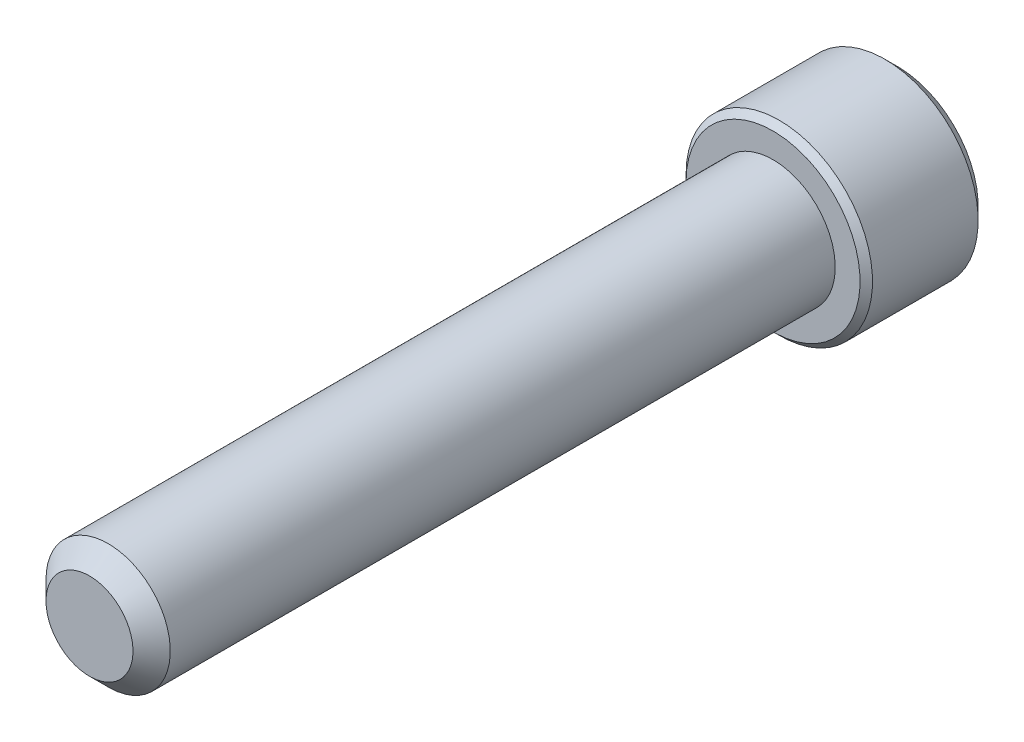
ISO-10303-21;
HEADER;
FILE_DESCRIPTION(('STEP AP214'),'2;1');
FILE_NAME('part.step','',(''),(''),'','','');
FILE_SCHEMA(('AUTOMOTIVE_DESIGN { 1 0 10303 214 1 1 1 1 }'));
ENDSEC;
DATA;
#1=APPLICATION_CONTEXT('core data for automotive mechanical design processes');
#2=APPLICATION_PROTOCOL_DEFINITION('international standard','automotive_design',2000,#1);
#3=PRODUCT_CONTEXT('',#1,'mechanical');
#4=PRODUCT('Part','Part','',(#3));
#5=PRODUCT_RELATED_PRODUCT_CATEGORY('part','',(#4));
#6=PRODUCT_DEFINITION_FORMATION('','',#4);
#7=PRODUCT_DEFINITION_CONTEXT('part definition',#1,'design');
#8=PRODUCT_DEFINITION('design','',#6,#7);
#9=PRODUCT_DEFINITION_SHAPE('','',#8);
#10=(LENGTH_UNIT() NAMED_UNIT(*) SI_UNIT(.MILLI.,.METRE.));
#11=(NAMED_UNIT(*) PLANE_ANGLE_UNIT() SI_UNIT($,.RADIAN.));
#12=(NAMED_UNIT(*) SI_UNIT($,.STERADIAN.) SOLID_ANGLE_UNIT());
#13=UNCERTAINTY_MEASURE_WITH_UNIT(LENGTH_MEASURE(1.E-05),#10,'distance_accuracy_value','');
#14=(GEOMETRIC_REPRESENTATION_CONTEXT(3) GLOBAL_UNCERTAINTY_ASSIGNED_CONTEXT((#13)) GLOBAL_UNIT_ASSIGNED_CONTEXT((#10,
#11,#12)) REPRESENTATION_CONTEXT('',''));
#15=CARTESIAN_POINT('',(0.,0.,0.));
#16=DIRECTION('',(0.,0.,1.));
#17=DIRECTION('',(1.,0.,0.));
#18=AXIS2_PLACEMENT_3D('',#15,#16,#17);
#19=CARTESIAN_POINT('',(0.,0.,-34.925));
#20=DIRECTION('',(0.,0.,1.));
#21=DIRECTION('',(1.,0.,0.));
#22=AXIS2_PLACEMENT_3D('',#19,#20,#21);
#23=CYLINDRICAL_SURFACE('',#22,3.175);
#24=CARTESIAN_POINT('',(0.,0.,-0.952500000000002));
#25=DIRECTION('',(0.,0.,1.));
#26=DIRECTION('',(1.,0.,0.));
#27=AXIS2_PLACEMENT_3D('',#24,#25,#26);
#28=CIRCLE('',#27,3.175);
#29=CARTESIAN_POINT('',(-3.175,0.,-0.952500000000002));
#30=VERTEX_POINT('',#29);
#31=EDGE_CURVE('E108',#30,#30,#28,.F.);
#32=ORIENTED_EDGE('',*,*,#31,.T.);
#33=EDGE_LOOP('',(#32));
#34=FACE_BOUND('',#33,.T.);
#35=CARTESIAN_POINT('',(0.,0.,-34.925));
#36=DIRECTION('',(0.,0.,-1.));
#37=DIRECTION('',(-1.,0.,0.));
#38=AXIS2_PLACEMENT_3D('',#35,#36,#37);
#39=CIRCLE('',#38,3.175);
#40=CARTESIAN_POINT('',(-3.175,0.,-34.925));
#41=VERTEX_POINT('',#40);
#42=EDGE_CURVE('E208',#41,#41,#39,.F.);
#43=ORIENTED_EDGE('',*,*,#42,.T.);
#44=EDGE_LOOP('',(#43));
#45=FACE_BOUND('',#44,.T.);
#46=ADVANCED_FACE('F34',(#34,#45),#23,.T.);
#47=CARTESIAN_POINT('',(0.,0.,0.));
#48=DIRECTION('',(0.,0.,1.));
#49=DIRECTION('',(1.,0.,0.));
#50=AXIS2_PLACEMENT_3D('',#47,#48,#49);
#51=PLANE('',#50);
#52=CARTESIAN_POINT('',(0.,0.,0.));
#53=DIRECTION('',(0.,0.,1.));
#54=DIRECTION('',(1.,0.,0.));
#55=AXIS2_PLACEMENT_3D('',#52,#53,#54);
#56=CIRCLE('',#55,2.2225);
#57=CARTESIAN_POINT('',(-2.2225,0.,0.));
#58=VERTEX_POINT('',#57);
#59=EDGE_CURVE('E207',#58,#58,#56,.T.);
#60=ORIENTED_EDGE('',*,*,#59,.T.);
#61=EDGE_LOOP('',(#60));
#62=FACE_BOUND('',#61,.T.);
#63=ADVANCED_FACE('F185',(#62),#51,.T.);
#64=CARTESIAN_POINT('',(0.,0.,0.));
#65=DIRECTION('',(0.,0.,-1.));
#66=DIRECTION('',(-1.,0.,0.));
#67=AXIS2_PLACEMENT_3D('',#64,#65,#66);
#68=CONICAL_SURFACE('',#67,2.2225,0.785398163397446);
#69=CARTESIAN_POINT('',(-3.175,0.,-0.952500000000002));
#70=CARTESIAN_POINT('',(-3.165078125,0.,-0.942578125000002));
#71=CARTESIAN_POINT('',(-3.15515625,0.,-0.932656250000002));
#72=CARTESIAN_POINT('',(-3.1353125,0.,-0.912812500000002));
#73=CARTESIAN_POINT('',(-3.125390625,0.,-0.902890625000002));
#74=CARTESIAN_POINT('',(-3.105546875,0.,-0.883046875000002));
#75=CARTESIAN_POINT('',(-3.095625,0.,-0.873125000000002));
#76=CARTESIAN_POINT('',(-3.07578125,0.,-0.853281250000002));
#77=CARTESIAN_POINT('',(-3.065859375,0.,-0.843359375000002));
#78=CARTESIAN_POINT('',(-3.046015625,0.,-0.823515625000002));
#79=CARTESIAN_POINT('',(-3.03609375,0.,-0.813593750000002));
#80=CARTESIAN_POINT('',(-3.01625,0.,-0.793750000000002));
#81=CARTESIAN_POINT('',(-3.006328125,0.,-0.783828125000002));
#82=CARTESIAN_POINT('',(-2.986484375,0.,-0.763984375000002));
#83=CARTESIAN_POINT('',(-2.9765625,0.,-0.754062500000002));
#84=CARTESIAN_POINT('',(-2.95671875,0.,-0.734218750000002));
#85=CARTESIAN_POINT('',(-2.946796875,0.,-0.724296875000002));
#86=CARTESIAN_POINT('',(-2.926953125,0.,-0.704453125000002));
#87=CARTESIAN_POINT('',(-2.91703125,0.,-0.694531250000002));
#88=CARTESIAN_POINT('',(-2.8971875,0.,-0.674687500000001));
#89=CARTESIAN_POINT('',(-2.887265625,0.,-0.664765625000001));
#90=CARTESIAN_POINT('',(-2.867421875,0.,-0.644921875000001));
#91=CARTESIAN_POINT('',(-2.8575,0.,-0.635000000000001));
#92=CARTESIAN_POINT('',(-2.83765625,0.,-0.615156250000001));
#93=CARTESIAN_POINT('',(-2.827734375,0.,-0.605234375000001));
#94=CARTESIAN_POINT('',(-2.807890625,0.,-0.585390625000001));
#95=CARTESIAN_POINT('',(-2.79796875,0.,-0.575468750000001));
#96=CARTESIAN_POINT('',(-2.778125,0.,-0.555625000000001));
#97=CARTESIAN_POINT('',(-2.768203125,0.,-0.545703125000001));
#98=CARTESIAN_POINT('',(-2.748359375,0.,-0.525859375000001));
#99=CARTESIAN_POINT('',(-2.7384375,0.,-0.515937500000001));
#100=CARTESIAN_POINT('',(-2.71859375,0.,-0.496093750000001));
#101=CARTESIAN_POINT('',(-2.708671875,0.,-0.486171875000001));
#102=CARTESIAN_POINT('',(-2.688828125,0.,-0.466328125000001));
#103=CARTESIAN_POINT('',(-2.67890625,0.,-0.456406250000001));
#104=CARTESIAN_POINT('',(-2.6590625,0.,-0.436562500000001));
#105=CARTESIAN_POINT('',(-2.649140625,0.,-0.426640625000001));
#106=CARTESIAN_POINT('',(-2.629296875,0.,-0.406796875000001));
#107=CARTESIAN_POINT('',(-2.619375,0.,-0.396875000000001));
#108=CARTESIAN_POINT('',(-2.59953125,0.,-0.377031250000001));
#109=CARTESIAN_POINT('',(-2.589609375,0.,-0.367109375000001));
#110=CARTESIAN_POINT('',(-2.569765625,0.,-0.347265625000001));
#111=CARTESIAN_POINT('',(-2.55984375,0.,-0.337343750000001));
#112=CARTESIAN_POINT('',(-2.54,0.,-0.317500000000001));
#113=CARTESIAN_POINT('',(-2.530078125,0.,-0.307578125000001));
#114=CARTESIAN_POINT('',(-2.510234375,0.,-0.287734375000001));
#115=CARTESIAN_POINT('',(-2.5003125,0.,-0.277812500000001));
#116=CARTESIAN_POINT('',(-2.48046875,0.,-0.257968750000001));
#117=CARTESIAN_POINT('',(-2.470546875,0.,-0.248046875));
#118=CARTESIAN_POINT('',(-2.450703125,0.,-0.228203125));
#119=CARTESIAN_POINT('',(-2.44078125,0.,-0.21828125));
#120=CARTESIAN_POINT('',(-2.4209375,0.,-0.1984375));
#121=CARTESIAN_POINT('',(-2.411015625,0.,-0.188515625));
#122=CARTESIAN_POINT('',(-2.391171875,0.,-0.168671875));
#123=CARTESIAN_POINT('',(-2.38125,0.,-0.15875));
#124=CARTESIAN_POINT('',(-2.36140625,0.,-0.13890625));
#125=CARTESIAN_POINT('',(-2.351484375,0.,-0.128984375));
#126=CARTESIAN_POINT('',(-2.331640625,0.,-0.109140625));
#127=CARTESIAN_POINT('',(-2.32171875,0.,-0.0992187500000001));
#128=CARTESIAN_POINT('',(-2.301875,0.,-0.0793750000000001));
#129=CARTESIAN_POINT('',(-2.291953125,0.,-0.0694531250000002));
#130=CARTESIAN_POINT('',(-2.272109375,0.,-0.0496093750000001));
#131=CARTESIAN_POINT('',(-2.2621875,0.,-0.0396875000000001));
#132=CARTESIAN_POINT('',(-2.24234375,0.,-0.01984375));
#133=CARTESIAN_POINT('',(-2.232421875,0.,-0.00992187499999998));
#134=CARTESIAN_POINT('',(-2.2225,0.,0.));
#135=B_SPLINE_CURVE_WITH_KNOTS('',3,(#69,#70,#71,#72,#73,#74,#75,#76,#77,#78,#79,#80,#81,#82,
#83,#84,#85,#86,#87,#88,#89,#90,#91,#92,#93,#94,#95,#96,#97,#98,#99,#100,#101,#102,#103,#104,
#105,#106,#107,#108,#109,#110,#111,#112,#113,#114,#115,#116,#117,#118,#119,#120,#121,#122,#123,
#124,#125,#126,#127,#128,#129,#130,#131,#132,#133,#134),.UNSPECIFIED.,.F.,.F.,(4,2,2,2,2,2,2,2,
2,2,2,2,2,2,2,2,2,2,2,2,2,2,2,2,2,2,2,2,2,2,2,2,4),(0.,0.0420949505675116,0.0841899011350232,
0.126284851702535,0.168379802270046,0.210474752837558,0.25256970340507,0.294664653972581,
0.336759604540093,0.378854555107605,0.420949505675116,0.463044456242628,0.50513940681014,
0.547234357377651,0.589329307945163,0.631424258512675,0.673519209080186,0.715614159647698,
0.75770911021521,0.799804060782721,0.841899011350233,0.883993961917745,0.926088912485256,
0.968183863052768,1.01027881362028,1.05237376418779,1.0944687147553,1.13656366532281,
1.17865861589033,1.22075356645784,1.26284851702535,1.30494346759286,1.34703841816037),.UNSPECIFIED.);
#136=EDGE_CURVE('BSEAM191',#30,#58,#135,.T.);
#137=ORIENTED_EDGE('',*,*,#31,.F.);
#138=ORIENTED_EDGE('',*,*,#59,.F.);
#139=ORIENTED_EDGE('',*,*,#136,.T.);
#140=ORIENTED_EDGE('',*,*,#136,.F.);
#141=EDGE_LOOP('',(#137,#139,#138,#140));
#142=FACE_BOUND('',#141,.T.);
#143=ADVANCED_FACE('F191',(#142),#68,.T.);
#144=CARTESIAN_POINT('',(0.,0.,-41.275));
#145=DIRECTION('',(0.,0.,1.));
#146=DIRECTION('',(1.,0.,0.));
#147=AXIS2_PLACEMENT_3D('',#144,#145,#146);
#148=CYLINDRICAL_SURFACE('',#147,4.7625);
#149=CARTESIAN_POINT('',(0.,0.,-35.2425));
#150=DIRECTION('',(0.,0.,-1.));
#151=DIRECTION('',(-1.,0.,0.));
#152=AXIS2_PLACEMENT_3D('',#149,#150,#151);
#153=CIRCLE('',#152,4.7625);
#154=CARTESIAN_POINT('',(-4.7625,0.,-35.2425));
#155=VERTEX_POINT('',#154);
#156=EDGE_CURVE('E42',#155,#155,#153,.T.);
#157=ORIENTED_EDGE('',*,*,#156,.T.);
#158=EDGE_LOOP('',(#157));
#159=FACE_BOUND('',#158,.T.);
#160=CARTESIAN_POINT('',(0.,0.,-40.64));
#161=DIRECTION('',(0.,0.,-1.));
#162=DIRECTION('',(-1.,0.,0.));
#163=AXIS2_PLACEMENT_3D('',#160,#161,#162);
#164=CIRCLE('',#163,4.7625);
#165=CARTESIAN_POINT('',(-4.7625,0.,-40.64));
#166=VERTEX_POINT('',#165);
#167=EDGE_CURVE('E168',#166,#166,#164,.F.);
#168=ORIENTED_EDGE('',*,*,#167,.T.);
#169=EDGE_LOOP('',(#168));
#170=FACE_BOUND('',#169,.T.);
#171=ADVANCED_FACE('F173',(#159,#170),#148,.T.);
#172=CARTESIAN_POINT('',(0.,0.,-41.275));
#173=DIRECTION('',(0.,0.,-1.));
#174=DIRECTION('',(-1.,0.,0.));
#175=AXIS2_PLACEMENT_3D('',#172,#173,#174);
#176=PLANE('',#175);
#177=CARTESIAN_POINT('',(0.,0.,-41.275));
#178=DIRECTION('',(0.,0.,-1.));
#179=DIRECTION('',(-1.,0.,0.));
#180=AXIS2_PLACEMENT_3D('',#177,#178,#179);
#181=CIRCLE('',#180,4.1275);
#182=CARTESIAN_POINT('',(-4.1275,0.,-41.275));
#183=VERTEX_POINT('',#182);
#184=EDGE_CURVE('E107',#183,#183,#181,.T.);
#185=ORIENTED_EDGE('',*,*,#184,.T.);
#186=EDGE_LOOP('',(#185));
#187=FACE_BOUND('',#186,.T.);
#188=CARTESIAN_POINT('',(0.,0.,-41.275));
#189=DIRECTION('',(0.,0.,-1.));
#190=DIRECTION('',(-1.,0.,0.));
#191=AXIS2_PLACEMENT_3D('',#188,#189,#190);
#192=CIRCLE('',#191,2.74963065701559);
#193=CARTESIAN_POINT('',(-2.38125,1.3748153285078,-41.275));
#194=VERTEX_POINT('',#193);
#195=CARTESIAN_POINT('',(0.,2.74963065701559,-41.275));
#196=VERTEX_POINT('',#195);
#197=EDGE_CURVE('E88',#194,#196,#192,.T.);
#198=ORIENTED_EDGE('',*,*,#197,.F.);
#199=CARTESIAN_POINT('',(-2.38125,-1.3748153285078,-41.275));
#200=VERTEX_POINT('',#199);
#201=EDGE_CURVE('E48',#200,#194,#192,.T.);
#202=ORIENTED_EDGE('',*,*,#201,.F.);
#203=CARTESIAN_POINT('',(0.,-2.74963065701559,-41.275));
#204=VERTEX_POINT('',#203);
#205=EDGE_CURVE('E264',#204,#200,#192,.T.);
#206=ORIENTED_EDGE('',*,*,#205,.F.);
#207=CARTESIAN_POINT('',(2.38125,-1.3748153285078,-41.275));
#208=VERTEX_POINT('',#207);
#209=EDGE_CURVE('E55',#208,#204,#192,.T.);
#210=ORIENTED_EDGE('',*,*,#209,.F.);
#211=CARTESIAN_POINT('',(2.38125,1.3748153285078,-41.275));
#212=VERTEX_POINT('',#211);
#213=EDGE_CURVE('E129',#212,#208,#192,.T.);
#214=ORIENTED_EDGE('',*,*,#213,.F.);
#215=EDGE_CURVE('E97',#196,#212,#192,.T.);
#216=ORIENTED_EDGE('',*,*,#215,.F.);
#217=EDGE_LOOP('',(#198,#202,#206,#210,#214,#216));
#218=FACE_BOUND('',#217,.T.);
#219=ADVANCED_FACE('F128',(#187,#218),#176,.T.);
#220=CARTESIAN_POINT('',(0.,0.,-34.925));
#221=DIRECTION('',(0.,0.,-1.));
#222=DIRECTION('',(-1.,0.,0.));
#223=AXIS2_PLACEMENT_3D('',#220,#221,#222);
#224=PLANE('',#223);
#225=CARTESIAN_POINT('',(0.,0.,-34.925));
#226=DIRECTION('',(0.,0.,-1.));
#227=DIRECTION('',(-1.,0.,0.));
#228=AXIS2_PLACEMENT_3D('',#225,#226,#227);
#229=CIRCLE('',#228,4.445);
#230=CARTESIAN_POINT('',(-4.445,0.,-34.925));
#231=VERTEX_POINT('',#230);
#232=EDGE_CURVE('E11',#231,#231,#229,.F.);
#233=ORIENTED_EDGE('',*,*,#232,.T.);
#234=EDGE_LOOP('',(#233));
#235=FACE_BOUND('',#234,.T.);
#236=ORIENTED_EDGE('',*,*,#42,.F.);
#237=EDGE_LOOP('',(#236));
#238=FACE_BOUND('',#237,.T.);
#239=ADVANCED_FACE('F276',(#235,#238),#224,.F.);
#240=CARTESIAN_POINT('',(0.,0.,-41.275));
#241=DIRECTION('',(0.,0.,-1.));
#242=DIRECTION('',(-1.,0.,0.));
#243=AXIS2_PLACEMENT_3D('',#240,#241,#242);
#244=CONICAL_SURFACE('',#243,2.74963065701559,0.78539816339745);
#245=ORIENTED_EDGE('',*,*,#215,.T.);
#246=CARTESIAN_POINT('',(-0.000199999999999846,2.74974612706943,-41.2751154773272));
#247=CARTESIAN_POINT('',(0.0816567823790498,2.70248609172789,-41.2278948967095));
#248=CARTESIAN_POINT('',(0.16488233377176,2.65443579722785,-41.1834475752929));
#249=CARTESIAN_POINT('',(0.33458848083804,2.556455907536,-41.1020654569856));
#250=CARTESIAN_POINT('',(0.421085217353104,2.50651699342501,-41.0651759430951));
#251=CARTESIAN_POINT('',(0.595501774009043,2.40581754748857,-41.0019834131659));
#252=CARTESIAN_POINT('',(0.683377171180675,2.35508266327638,-40.9755215587295));
#253=CARTESIAN_POINT('',(0.861062594070876,2.25249593653965,-40.9347515156161));
#254=CARTESIAN_POINT('',(0.950867191185872,2.20064722822085,-40.9204128915305));
#255=CARTESIAN_POINT('',(1.10563960313034,2.11128933452158,-40.9074757847701));
#256=CARTESIAN_POINT('',(1.17040744896962,2.07389560129144,-40.9055606046532));
#257=CARTESIAN_POINT('',(1.29983727933557,1.99916925388849,-40.9087866227677));
#258=CARTESIAN_POINT('',(1.36449921879336,1.96183666573621,-40.9139302948571));
#259=CARTESIAN_POINT('',(1.4932125485774,1.88752399013711,-40.9309813108716));
#260=CARTESIAN_POINT('',(1.55726317423486,1.85054434417201,-40.9428962213493));
#261=CARTESIAN_POINT('',(1.68425683890527,1.77722451768916,-40.972835672352));
#262=CARTESIAN_POINT('',(1.74719996243583,1.74088428837517,-40.9908597445185));
#263=CARTESIAN_POINT('',(1.90842615073218,1.64780030516185,-41.0443688075524));
#264=CARTESIAN_POINT('',(2.00570949128784,1.59163374230437,-41.0838874208722));
#265=CARTESIAN_POINT('',(2.14875606262557,1.50904576583588,-41.1506003435508));
#266=CARTESIAN_POINT('',(2.19589628894397,1.48182934348129,-41.1740402091113));
#267=CARTESIAN_POINT('',(2.28930352636664,1.42790064981105,-41.2230566766595));
#268=CARTESIAN_POINT('',(2.33557105249682,1.40118808114506,-41.2486319667669));
#269=CARTESIAN_POINT('',(2.38145,1.37469985845396,-41.2751154773272));
#270=B_SPLINE_CURVE_WITH_KNOTS('',3,(#246,#247,#248,#249,#250,#251,#252,#253,#254,#255,#256,
#257,#258,#259,#260,#261,#262,#263,#264,#265,#266,#267,#268,#269),.UNSPECIFIED.,.F.,.F.,(4,2,2,
2,2,2,2,2,2,2,2,4),(0.,0.317196610611949,0.636241461041219,0.950218950629222,1.26340583824126,
1.48752413747844,1.71172100167747,1.93616888974082,2.16059957440836,2.51709639744763,
2.69486147369099,2.87251813383154),.UNSPECIFIED.);
#271=EDGE_CURVE('E102',#196,#212,#270,.T.);
#272=ORIENTED_EDGE('',*,*,#271,.F.);
#273=EDGE_LOOP('',(#245,#272));
#274=FACE_BOUND('',#273,.T.);
#275=ADVANCED_FACE('F103',(#274),#244,.F.);
#276=ORIENTED_EDGE('',*,*,#213,.T.);
#277=CARTESIAN_POINT('',(2.38125,-2.76261914417824,-42.1726170859106));
#278=CARTESIAN_POINT('',(2.38125,-2.69544479514943,-42.1217472144995));
#279=CARTESIAN_POINT('',(2.38125,-2.62789666136504,-42.071362945401));
#280=CARTESIAN_POINT('',(2.38125,-2.49190448957586,-41.9717837706916));
#281=CARTESIAN_POINT('',(2.38125,-2.42346023302515,-41.9225891638687));
#282=CARTESIAN_POINT('',(2.38125,-2.28502676055597,-41.8252575506406));
#283=CARTESIAN_POINT('',(2.38125,-2.21502968474887,-41.7771316855727));
#284=CARTESIAN_POINT('',(2.38125,-2.07385103533268,-41.6826556100283));
#285=CARTESIAN_POINT('',(2.38125,-2.00266954553302,-41.636305274675));
#286=CARTESIAN_POINT('',(2.38125,-1.85474026830089,-41.5431368560841));
#287=CARTESIAN_POINT('',(2.38125,-1.7779099562422,-41.4964491375715));
#288=CARTESIAN_POINT('',(2.38125,-1.62247617005921,-41.4061296057942));
#289=CARTESIAN_POINT('',(2.38125,-1.5438729311814,-41.3624973902174));
#290=CARTESIAN_POINT('',(2.38125,-1.38486272128664,-41.2792071099829));
#291=CARTESIAN_POINT('',(2.38125,-1.30446163385102,-41.2395379008969));
#292=CARTESIAN_POINT('',(2.38125,-1.14145314541121,-41.1650690458985));
#293=CARTESIAN_POINT('',(2.38125,-1.05884677103565,-41.1302671795911));
#294=CARTESIAN_POINT('',(2.38125,-0.898296083282611,-41.0694298132105));
#295=CARTESIAN_POINT('',(2.38125,-0.820539229676336,-41.0429047139138));
#296=CARTESIAN_POINT('',(2.38125,-0.663135380788208,-40.99608983919));
#297=CARTESIAN_POINT('',(2.38125,-0.583488257424664,-40.9758004875941));
#298=CARTESIAN_POINT('',(2.38125,-0.424114177011518,-40.9428604073761));
#299=CARTESIAN_POINT('',(2.38125,-0.344414987413468,-40.9300775336893));
#300=CARTESIAN_POINT('',(2.38125,-0.184141832260061,-40.9124018129175));
#301=CARTESIAN_POINT('',(2.38125,-0.103568024425043,-40.9075075663093));
#302=CARTESIAN_POINT('',(2.38125,0.0546452705616247,-40.9059814589787));
#303=CARTESIAN_POINT('',(2.38125,0.132281935936973,-40.9090477838014));
#304=CARTESIAN_POINT('',(2.38125,0.28689976194694,-40.9226029014762));
#305=CARTESIAN_POINT('',(2.38125,0.363880858805095,-40.9330924083237));
#306=CARTESIAN_POINT('',(2.38125,0.517934845692858,-40.9610957917082));
#307=CARTESIAN_POINT('',(2.38125,0.594985552658723,-40.9787299282713));
#308=CARTESIAN_POINT('',(2.38125,0.747397785123016,-41.0200790150478));
#309=CARTESIAN_POINT('',(2.38125,0.822759444233745,-41.0437934824167));
#310=CARTESIAN_POINT('',(2.38125,1.05910849758949,-41.1271079749778));
#311=CARTESIAN_POINT('',(2.38125,1.21677702119331,-41.1961581303657));
#312=CARTESIAN_POINT('',(2.38125,1.44750538939386,-41.3112600463764));
#313=CARTESIAN_POINT('',(2.38125,1.52359597421916,-41.3516390557991));
#314=CARTESIAN_POINT('',(2.38125,1.67404919609774,-41.4355045048813));
#315=CARTESIAN_POINT('',(2.38125,1.74841214000064,-41.4789903870446));
#316=CARTESIAN_POINT('',(2.38125,1.89195740338856,-41.5662197494794));
#317=CARTESIAN_POINT('',(2.38125,1.96121356031988,-41.6098431033927));
#318=CARTESIAN_POINT('',(2.38125,2.09853826202221,-41.6989297074865));
#319=CARTESIAN_POINT('',(2.38125,2.16660671643358,-41.7443930967897));
#320=CARTESIAN_POINT('',(2.38125,2.30115854952532,-41.8364552847002));
#321=CARTESIAN_POINT('',(2.38125,2.36765030430945,-41.8830418921343));
#322=CARTESIAN_POINT('',(2.38125,2.49972444234839,-41.9774503252218));
#323=CARTESIAN_POINT('',(2.38125,2.56530707078417,-42.0252718074761));
#324=CARTESIAN_POINT('',(2.38125,2.63050907003793,-42.0735984125418));
#325=B_SPLINE_CURVE_WITH_KNOTS('',3,(#277,#278,#279,#280,#281,#282,#283,#284,#285,#286,#287,
#288,#289,#290,#291,#292,#293,#294,#295,#296,#297,#298,#299,#300,#301,#302,#303,#304,#305,#306,
#307,#308,#309,#310,#311,#312,#313,#314,#315,#316,#317,#318,#319,#320,#321,#322,#323,#324),
.UNSPECIFIED.,.F.,.F.,(4,2,2,2,2,2,2,2,2,2,2,2,2,2,2,2,2,2,2,2,2,2,2,4),(0.,0.252791871571639,
0.505646586835588,0.760459562131608,1.01525458283614,1.28490904188232,1.55452792903167,
1.82336591130764,2.09208085165785,2.33833488206072,2.58460564615637,2.82639989360531,
3.06815123955512,3.30087188920716,3.53361492603846,3.77045005601639,4.00726638452656,
4.52203846870486,4.78044014413052,5.03879556793986,5.28431582240012,5.52985467514943,
5.77340315432296,6.0168846207659),.UNSPECIFIED.);
#326=EDGE_CURVE('E96',#212,#208,#325,.F.);
#327=ORIENTED_EDGE('',*,*,#326,.F.);
#328=EDGE_LOOP('',(#276,#327));
#329=FACE_BOUND('',#328,.T.);
#330=ADVANCED_FACE('F270',(#329),#244,.F.);
#331=ORIENTED_EDGE('',*,*,#209,.T.);
#332=CARTESIAN_POINT('',(2.38145,-1.37469985845396,-41.2751154773272));
#333=CARTESIAN_POINT('',(2.29959321762095,-1.4219598937955,-41.2278948967095));
#334=CARTESIAN_POINT('',(2.21636766622824,-1.47001018829554,-41.1834475752929));
#335=CARTESIAN_POINT('',(2.04666151916196,-1.56799007798739,-41.1020654569856));
#336=CARTESIAN_POINT('',(1.9601647826469,-1.61792899209838,-41.0651759430951));
#337=CARTESIAN_POINT('',(1.78574822599096,-1.71862843803482,-41.0019834131659));
#338=CARTESIAN_POINT('',(1.69787282881933,-1.769363322247,-40.9755215587295));
#339=CARTESIAN_POINT('',(1.52018740592912,-1.87195004898373,-40.9347515156161));
#340=CARTESIAN_POINT('',(1.43038280881413,-1.92379875730254,-40.9204128915305));
#341=CARTESIAN_POINT('',(1.27561039686966,-2.01315665100181,-40.9074757847701));
#342=CARTESIAN_POINT('',(1.21084255103038,-2.05055038423195,-40.9055606046532));
#343=CARTESIAN_POINT('',(1.08141272066443,-2.1252767316349,-40.9087866227677));
#344=CARTESIAN_POINT('',(1.01675078120664,-2.16260931978717,-40.9139302948571));
#345=CARTESIAN_POINT('',(0.888037451422603,-2.23692199538628,-40.9309813108716));
#346=CARTESIAN_POINT('',(0.823986825765145,-2.27390164135138,-40.9428962213493));
#347=CARTESIAN_POINT('',(0.696993161094726,-2.34722146783423,-40.972835672352));
#348=CARTESIAN_POINT('',(0.634050037564175,-2.38356169714822,-40.9908597445185));
#349=CARTESIAN_POINT('',(0.472823849267819,-2.47664568036154,-41.0443688075524));
#350=CARTESIAN_POINT('',(0.37554050871216,-2.53281224321902,-41.0838874208722));
#351=CARTESIAN_POINT('',(0.232493937374431,-2.61540021968751,-41.1506003435508));
#352=CARTESIAN_POINT('',(0.185353711056037,-2.64261664204209,-41.1740402091113));
#353=CARTESIAN_POINT('',(0.0919464736333636,-2.69654533571233,-41.2230566766595));
#354=CARTESIAN_POINT('',(0.0456789475031804,-2.72325790437833,-41.2486319667669));
#355=CARTESIAN_POINT('',(-0.000199999999998627,-2.74974612706943,-41.2751154773272));
#356=B_SPLINE_CURVE_WITH_KNOTS('',3,(#332,#333,#334,#335,#336,#337,#338,#339,#340,#341,#342,
#343,#344,#345,#346,#347,#348,#349,#350,#351,#352,#353,#354,#355),.UNSPECIFIED.,.F.,.F.,(4,2,2,
2,2,2,2,2,2,2,2,4),(0.,0.317196610611949,0.636241461041219,0.950218950629222,1.26340583824126,
1.48752413747844,1.71172100167747,1.93616888974082,2.16059957440836,2.51709639744763,
2.69486147369099,2.87251813383154),.UNSPECIFIED.);
#357=EDGE_CURVE('E138',#208,#204,#356,.T.);
#358=ORIENTED_EDGE('',*,*,#357,.F.);
#359=EDGE_LOOP('',(#331,#358));
#360=FACE_BOUND('',#359,.T.);
#361=ADVANCED_FACE('F267',(#360),#244,.F.);
#362=ORIENTED_EDGE('',*,*,#205,.T.);
#363=CARTESIAN_POINT('',(0.000199999999999723,-2.74974612706943,-41.2751154773272));
#364=CARTESIAN_POINT('',(-0.0816567823790499,-2.70248609172789,-41.2278948967095));
#365=CARTESIAN_POINT('',(-0.16488233377176,-2.65443579722785,-41.1834475752929));
#366=CARTESIAN_POINT('',(-0.33458848083804,-2.556455907536,-41.1020654569856));
#367=CARTESIAN_POINT('',(-0.421085217353104,-2.50651699342501,-41.0651759430951));
#368=CARTESIAN_POINT('',(-0.595501774009043,-2.40581754748857,-41.0019834131659));
#369=CARTESIAN_POINT('',(-0.683377171180675,-2.35508266327639,-40.9755215587295));
#370=CARTESIAN_POINT('',(-0.861062594070876,-2.25249593653966,-40.9347515156161));
#371=CARTESIAN_POINT('',(-0.950867191185872,-2.20064722822085,-40.9204128915305));
#372=CARTESIAN_POINT('',(-1.10563960313034,-2.11128933452158,-40.9074757847701));
#373=CARTESIAN_POINT('',(-1.17040744896962,-2.07389560129144,-40.9055606046532));
#374=CARTESIAN_POINT('',(-1.29983727933557,-1.99916925388849,-40.9087866227677));
#375=CARTESIAN_POINT('',(-1.36449921879336,-1.96183666573621,-40.9139302948571));
#376=CARTESIAN_POINT('',(-1.4932125485774,-1.88752399013711,-40.9309813108716));
#377=CARTESIAN_POINT('',(-1.55726317423486,-1.85054434417201,-40.9428962213493));
#378=CARTESIAN_POINT('',(-1.68425683890528,-1.77722451768916,-40.972835672352));
#379=CARTESIAN_POINT('',(-1.74719996243583,-1.74088428837517,-40.9908597445185));
#380=CARTESIAN_POINT('',(-1.90842615073218,-1.64780030516185,-41.0443688075524));
#381=CARTESIAN_POINT('',(-2.00570949128784,-1.59163374230437,-41.0838874208722));
#382=CARTESIAN_POINT('',(-2.14875606262557,-1.50904576583588,-41.1506003435508));
#383=CARTESIAN_POINT('',(-2.19589628894397,-1.48182934348129,-41.1740402091113));
#384=CARTESIAN_POINT('',(-2.28930352636664,-1.42790064981105,-41.2230566766595));
#385=CARTESIAN_POINT('',(-2.33557105249682,-1.40118808114506,-41.2486319667669));
#386=CARTESIAN_POINT('',(-2.38145,-1.37469985845396,-41.2751154773272));
#387=B_SPLINE_CURVE_WITH_KNOTS('',3,(#363,#364,#365,#366,#367,#368,#369,#370,#371,#372,#373,
#374,#375,#376,#377,#378,#379,#380,#381,#382,#383,#384,#385,#386),.UNSPECIFIED.,.F.,.F.,(4,2,2,
2,2,2,2,2,2,2,2,4),(0.,0.317196610611949,0.636241461041218,0.950218950629222,1.26340583824126,
1.48752413747844,1.71172100167747,1.93616888974082,2.16059957440836,2.51709639744763,
2.69486147369099,2.87251813383154),.UNSPECIFIED.);
#388=EDGE_CURVE('E242',#204,#200,#387,.T.);
#389=ORIENTED_EDGE('',*,*,#388,.F.);
#390=EDGE_LOOP('',(#362,#389));
#391=FACE_BOUND('',#390,.T.);
#392=ADVANCED_FACE('F266',(#391),#244,.F.);
#393=ORIENTED_EDGE('',*,*,#201,.T.);
#394=CARTESIAN_POINT('',(-2.38125,-2.76261914440418,-42.1726170860817));
#395=CARTESIAN_POINT('',(-2.38125,-2.69544479536901,-42.1217472146641));
#396=CARTESIAN_POINT('',(-2.38125,-2.62789666157822,-42.0713629455589));
#397=CARTESIAN_POINT('',(-2.38125,-2.4919044897762,-41.9717837708364));
#398=CARTESIAN_POINT('',(-2.38125,-2.42346023321903,-41.9225891640069));
#399=CARTESIAN_POINT('',(-2.38125,-2.28502676073673,-41.8252575507657));
#400=CARTESIAN_POINT('',(-2.38125,-2.21502968492295,-41.7771316856912));
#401=CARTESIAN_POINT('',(-2.38125,-2.0738510354933,-41.6826556101338));
#402=CARTESIAN_POINT('',(-2.38125,-2.00266954568685,-41.6363052747739));
#403=CARTESIAN_POINT('',(-2.38125,-1.85474026844006,-41.5431368561695));
#404=CARTESIAN_POINT('',(-2.38125,-1.7779099563735,-41.49644913765));
#405=CARTESIAN_POINT('',(-2.38125,-1.62247617017446,-41.406129605859));
#406=CARTESIAN_POINT('',(-2.38125,-1.54387293128849,-41.3624973902755));
#407=CARTESIAN_POINT('',(-2.38125,-1.38486272137713,-41.2792071100282));
#408=CARTESIAN_POINT('',(-2.38125,-1.30446163393306,-41.2395379009361));
#409=CARTESIAN_POINT('',(-2.38125,-1.14145314547589,-41.1650690459263));
#410=CARTESIAN_POINT('',(-2.38125,-1.05884677109141,-41.1302671796135));
#411=CARTESIAN_POINT('',(-2.38125,-0.89829608333455,-41.069429813229));
#412=CARTESIAN_POINT('',(-2.38125,-0.820539229733749,-41.0429047139327));
#413=CARTESIAN_POINT('',(-2.38125,-0.663135380856748,-40.9960898392085));
#414=CARTESIAN_POINT('',(-2.38125,-0.583488257498858,-40.9758004876119));
#415=CARTESIAN_POINT('',(-2.38125,-0.424114177096839,-40.9428604073913));
#416=CARTESIAN_POINT('',(-2.38125,-0.344414987504259,-40.9300775337025));
#417=CARTESIAN_POINT('',(-2.38125,-0.184141832361615,-40.9124018129255));
#418=CARTESIAN_POINT('',(-2.38125,-0.10356802453189,-40.9075075663141));
#419=CARTESIAN_POINT('',(-2.38125,0.0546452704451437,-40.9059814589761));
#420=CARTESIAN_POINT('',(-2.38125,0.132281935816136,-40.9090477837949));
#421=CARTESIAN_POINT('',(-2.38125,0.286899761817835,-40.9226029014608));
#422=CARTESIAN_POINT('',(-2.38125,0.363880858672078,-40.9330924083037));
#423=CARTESIAN_POINT('',(-2.38125,0.51793484555212,-40.9610957916784));
#424=CARTESIAN_POINT('',(-2.38125,0.594985552514187,-40.9787299282363));
#425=CARTESIAN_POINT('',(-2.38125,0.747397784971256,-41.0200790150024));
#426=CARTESIAN_POINT('',(-2.38125,0.822759444078557,-41.0437934823661));
#427=CARTESIAN_POINT('',(-2.38125,1.05910849740065,-41.1271079749025));
#428=CARTESIAN_POINT('',(-2.38125,1.21677702097592,-41.1961581302676));
#429=CARTESIAN_POINT('',(-2.38125,1.44750538913538,-41.3112600462423));
#430=CARTESIAN_POINT('',(-2.38125,1.52359597394722,-41.3516390556526));
#431=CARTESIAN_POINT('',(-2.38125,1.67404919579932,-41.4355045047098));
#432=CARTESIAN_POINT('',(-2.38125,1.7484121396892,-41.4789903868604));
#433=CARTESIAN_POINT('',(-2.38125,1.89195740305344,-41.566219749271));
#434=CARTESIAN_POINT('',(-2.38125,1.96121355997407,-41.6098431031729));
#435=CARTESIAN_POINT('',(-2.38125,2.09853826165518,-41.6989297072438));
#436=CARTESIAN_POINT('',(-2.38125,2.16660671605602,-41.7443930965356));
#437=CARTESIAN_POINT('',(-2.38125,2.30115854912694,-41.8364552844234));
#438=CARTESIAN_POINT('',(-2.38125,2.36765030390079,-41.8830418918462));
#439=CARTESIAN_POINT('',(-2.38125,2.49972444191923,-41.9774503249111));
#440=CARTESIAN_POINT('',(-2.38125,2.5653070703448,-42.0252718071541));
#441=CARTESIAN_POINT('',(-2.38125,2.63050906958836,-42.0735984122085));
#442=B_SPLINE_CURVE_WITH_KNOTS('',3,(#394,#395,#396,#397,#398,#399,#400,#401,#402,#403,#404,
#405,#406,#407,#408,#409,#410,#411,#412,#413,#414,#415,#416,#417,#418,#419,#420,#421,#422,#423,
#424,#425,#426,#427,#428,#429,#430,#431,#432,#433,#434,#435,#436,#437,#438,#439,#440,#441),
.UNSPECIFIED.,.F.,.F.,(4,2,2,2,2,2,2,2,2,2,2,2,2,2,2,2,2,2,2,2,2,2,2,4),(0.,0.252791871598823,
0.505646586889962,0.760459562213685,1.01525458294592,1.28490904202319,1.55452792920362,
1.82336591151044,2.09208085189144,2.33833488227845,2.58460564635827,2.82639989379204,
3.06815123972667,3.30087188936523,3.53361492618304,3.77045005614642,4.00726638464204,
4.52203846871501,4.78044014408765,5.03879556784398,5.2843158222589,5.52985467496287,
5.77340315409167,6.01688462048988),.UNSPECIFIED.);
#443=EDGE_CURVE('E118',#200,#194,#442,.T.);
#444=ORIENTED_EDGE('',*,*,#443,.F.);
#445=EDGE_LOOP('',(#393,#444));
#446=FACE_BOUND('',#445,.T.);
#447=ADVANCED_FACE('F283',(#446),#244,.F.);
#448=ORIENTED_EDGE('',*,*,#197,.T.);
#449=CARTESIAN_POINT('',(-2.38145,1.37469985845396,-41.2751154773272));
#450=CARTESIAN_POINT('',(-2.29959321762095,1.4219598937955,-41.2278948967095));
#451=CARTESIAN_POINT('',(-2.21636766622824,1.47001018829554,-41.1834475752929));
#452=CARTESIAN_POINT('',(-2.04666151916196,1.56799007798739,-41.1020654569856));
#453=CARTESIAN_POINT('',(-1.9601647826469,1.61792899209838,-41.0651759430951));
#454=CARTESIAN_POINT('',(-1.78574822599096,1.71862843803482,-41.0019834131659));
#455=CARTESIAN_POINT('',(-1.69787282881932,1.76936332224701,-40.9755215587295));
#456=CARTESIAN_POINT('',(-1.52018740592912,1.87195004898373,-40.9347515156161));
#457=CARTESIAN_POINT('',(-1.43038280881413,1.92379875730254,-40.9204128915305));
#458=CARTESIAN_POINT('',(-1.27561039686966,2.01315665100181,-40.9074757847701));
#459=CARTESIAN_POINT('',(-1.21084255103038,2.05055038423195,-40.9055606046532));
#460=CARTESIAN_POINT('',(-1.08141272066443,2.1252767316349,-40.9087866227677));
#461=CARTESIAN_POINT('',(-1.01675078120664,2.16260931978718,-40.9139302948571));
#462=CARTESIAN_POINT('',(-0.888037451422602,2.23692199538629,-40.9309813108716));
#463=CARTESIAN_POINT('',(-0.823986825765144,2.27390164135138,-40.9428962213493));
#464=CARTESIAN_POINT('',(-0.696993161094725,2.34722146783423,-40.972835672352));
#465=CARTESIAN_POINT('',(-0.634050037564174,2.38356169714822,-40.9908597445185));
#466=CARTESIAN_POINT('',(-0.472823849267817,2.47664568036154,-41.0443688075524));
#467=CARTESIAN_POINT('',(-0.375540508712159,2.53281224321902,-41.0838874208722));
#468=CARTESIAN_POINT('',(-0.23249393737443,2.61540021968751,-41.1506003435508));
#469=CARTESIAN_POINT('',(-0.185353711056036,2.64261664204209,-41.1740402091113));
#470=CARTESIAN_POINT('',(-0.0919464736333633,2.69654533571233,-41.2230566766595));
#471=CARTESIAN_POINT('',(-0.0456789475031802,2.72325790437833,-41.2486319667669));
#472=CARTESIAN_POINT('',(0.000199999999998731,2.74974612706943,-41.2751154773272));
#473=B_SPLINE_CURVE_WITH_KNOTS('',3,(#449,#450,#451,#452,#453,#454,#455,#456,#457,#458,#459,
#460,#461,#462,#463,#464,#465,#466,#467,#468,#469,#470,#471,#472),.UNSPECIFIED.,.F.,.F.,(4,2,2,
2,2,2,2,2,2,2,2,4),(0.,0.317196610611949,0.636241461041219,0.950218950629222,1.26340583824126,
1.48752413747844,1.71172100167747,1.93616888974082,2.16059957440836,2.51709639744763,
2.69486147369099,2.87251813383154),.UNSPECIFIED.);
#474=EDGE_CURVE('E92',#194,#196,#473,.T.);
#475=ORIENTED_EDGE('',*,*,#474,.F.);
#476=EDGE_LOOP('',(#448,#475));
#477=FACE_BOUND('',#476,.T.);
#478=ADVANCED_FACE('F90',(#477),#244,.F.);
#479=CARTESIAN_POINT('',(2.38125,4.12444598552339,-37.703125));
#480=DIRECTION('',(0.,0.,-1.));
#481=DIRECTION('',(-1.,0.,0.));
#482=AXIS2_PLACEMENT_3D('',#479,#480,#481);
#483=PLANE('',#482);
#484=DIRECTION('',(0.866025403784439,0.5,0.));
#485=VECTOR('',#484,1.);
#486=CARTESIAN_POINT('',(-2.38125,1.3748153285078,-37.703125));
#487=LINE('',#486,#485);
#488=CARTESIAN_POINT('',(-2.38125,1.3748153285078,-37.703125));
#489=VERTEX_POINT('',#488);
#490=CARTESIAN_POINT('',(0.,2.74963065701559,-37.703125));
#491=VERTEX_POINT('',#490);
#492=EDGE_CURVE('E117',#489,#491,#487,.T.);
#493=ORIENTED_EDGE('',*,*,#492,.T.);
#494=DIRECTION('',(0.866025403784439,-0.5,0.));
#495=VECTOR('',#494,1.);
#496=CARTESIAN_POINT('',(0.,2.74963065701559,-37.703125));
#497=LINE('',#496,#495);
#498=CARTESIAN_POINT('',(2.38125,1.3748153285078,-37.703125));
#499=VERTEX_POINT('',#498);
#500=EDGE_CURVE('E122',#491,#499,#497,.T.);
#501=ORIENTED_EDGE('',*,*,#500,.T.);
#502=DIRECTION('',(0.,-1.,0.));
#503=VECTOR('',#502,1.);
#504=CARTESIAN_POINT('',(2.38125,1.3748153285078,-37.703125));
#505=LINE('',#504,#503);
#506=CARTESIAN_POINT('',(2.38125,-1.3748153285078,-37.703125));
#507=VERTEX_POINT('',#506);
#508=EDGE_CURVE('E230',#499,#507,#505,.T.);
#509=ORIENTED_EDGE('',*,*,#508,.T.);
#510=DIRECTION('',(-0.866025403784439,-0.5,0.));
#511=VECTOR('',#510,1.);
#512=CARTESIAN_POINT('',(2.38125,-1.3748153285078,-37.703125));
#513=LINE('',#512,#511);
#514=CARTESIAN_POINT('',(0.,-2.74963065701559,-37.703125));
#515=VERTEX_POINT('',#514);
#516=EDGE_CURVE('E227',#507,#515,#513,.T.);
#517=ORIENTED_EDGE('',*,*,#516,.T.);
#518=DIRECTION('',(-0.866025403784439,0.5,0.));
#519=VECTOR('',#518,1.);
#520=CARTESIAN_POINT('',(0.,-2.74963065701559,-37.703125));
#521=LINE('',#520,#519);
#522=CARTESIAN_POINT('',(-2.38125,-1.3748153285078,-37.703125));
#523=VERTEX_POINT('',#522);
#524=EDGE_CURVE('E224',#515,#523,#521,.T.);
#525=ORIENTED_EDGE('',*,*,#524,.T.);
#526=DIRECTION('',(0.,1.,0.));
#527=VECTOR('',#526,1.);
#528=CARTESIAN_POINT('',(-2.38125,-1.3748153285078,-37.703125));
#529=LINE('',#528,#527);
#530=EDGE_CURVE('E125',#523,#489,#529,.T.);
#531=ORIENTED_EDGE('',*,*,#530,.T.);
#532=EDGE_LOOP('',(#493,#501,#509,#517,#525,#531));
#533=FACE_BOUND('',#532,.T.);
#534=ADVANCED_FACE('F157',(#533),#483,.T.);
#535=CARTESIAN_POINT('',(0.,2.74963065701559,-37.703125));
#536=DIRECTION('',(0.5,0.866025403784439,0.));
#537=DIRECTION('',(-0.866025403784439,0.5,0.));
#538=AXIS2_PLACEMENT_3D('',#535,#536,#537);
#539=PLANE('',#538);
#540=DIRECTION('',(0.,0.,-1.));
#541=VECTOR('',#540,1.);
#542=CARTESIAN_POINT('',(0.,2.74963065701559,-37.703125));
#543=LINE('',#542,#541);
#544=EDGE_CURVE('E114',#491,#196,#543,.T.);
#545=ORIENTED_EDGE('',*,*,#544,.T.);
#546=ORIENTED_EDGE('',*,*,#271,.T.);
#547=DIRECTION('',(0.,0.,-1.));
#548=VECTOR('',#547,1.);
#549=CARTESIAN_POINT('',(2.38125,1.3748153285078,-37.703125));
#550=LINE('',#549,#548);
#551=EDGE_CURVE('E124',#499,#212,#550,.T.);
#552=ORIENTED_EDGE('',*,*,#551,.F.);
#553=ORIENTED_EDGE('',*,*,#500,.F.);
#554=EDGE_LOOP('',(#545,#546,#552,#553));
#555=FACE_BOUND('',#554,.T.);
#556=ADVANCED_FACE('F120',(#555),#539,.F.);
#557=CARTESIAN_POINT('',(2.38125,1.3748153285078,-37.703125));
#558=DIRECTION('',(1.,0.,0.));
#559=DIRECTION('',(0.,0.,-1.));
#560=AXIS2_PLACEMENT_3D('',#557,#558,#559);
#561=PLANE('',#560);
#562=ORIENTED_EDGE('',*,*,#551,.T.);
#563=ORIENTED_EDGE('',*,*,#326,.T.);
#564=DIRECTION('',(0.,0.,-1.));
#565=VECTOR('',#564,1.);
#566=CARTESIAN_POINT('',(2.38125,-1.3748153285078,-37.703125));
#567=LINE('',#566,#565);
#568=EDGE_CURVE('E213',#507,#208,#567,.T.);
#569=ORIENTED_EDGE('',*,*,#568,.F.);
#570=ORIENTED_EDGE('',*,*,#508,.F.);
#571=EDGE_LOOP('',(#562,#563,#569,#570));
#572=FACE_BOUND('',#571,.T.);
#573=ADVANCED_FACE('F146',(#572),#561,.F.);
#574=CARTESIAN_POINT('',(2.38125,-1.3748153285078,-37.703125));
#575=DIRECTION('',(0.5,-0.866025403784438,0.));
#576=DIRECTION('',(0.866025403784439,0.5,0.));
#577=AXIS2_PLACEMENT_3D('',#574,#575,#576);
#578=PLANE('',#577);
#579=ORIENTED_EDGE('',*,*,#568,.T.);
#580=ORIENTED_EDGE('',*,*,#357,.T.);
#581=DIRECTION('',(0.,0.,-1.));
#582=VECTOR('',#581,1.);
#583=CARTESIAN_POINT('',(0.,-2.74963065701559,-37.703125));
#584=LINE('',#583,#582);
#585=EDGE_CURVE('E216',#515,#204,#584,.T.);
#586=ORIENTED_EDGE('',*,*,#585,.F.);
#587=ORIENTED_EDGE('',*,*,#516,.F.);
#588=EDGE_LOOP('',(#579,#580,#586,#587));
#589=FACE_BOUND('',#588,.T.);
#590=ADVANCED_FACE('F150',(#589),#578,.F.);
#591=CARTESIAN_POINT('',(0.,-2.74963065701559,-37.703125));
#592=DIRECTION('',(-0.5,-0.866025403784439,0.));
#593=DIRECTION('',(0.866025403784439,-0.5,0.));
#594=AXIS2_PLACEMENT_3D('',#591,#592,#593);
#595=PLANE('',#594);
#596=ORIENTED_EDGE('',*,*,#585,.T.);
#597=ORIENTED_EDGE('',*,*,#388,.T.);
#598=DIRECTION('',(0.,0.,-1.));
#599=VECTOR('',#598,1.);
#600=CARTESIAN_POINT('',(-2.38125,-1.3748153285078,-37.703125));
#601=LINE('',#600,#599);
#602=EDGE_CURVE('E219',#523,#200,#601,.T.);
#603=ORIENTED_EDGE('',*,*,#602,.F.);
#604=ORIENTED_EDGE('',*,*,#524,.F.);
#605=EDGE_LOOP('',(#596,#597,#603,#604));
#606=FACE_BOUND('',#605,.T.);
#607=ADVANCED_FACE('F249',(#606),#595,.F.);
#608=CARTESIAN_POINT('',(-2.38125,-1.3748153285078,-37.703125));
#609=DIRECTION('',(-1.,0.,0.));
#610=DIRECTION('',(0.,-1.,0.));
#611=AXIS2_PLACEMENT_3D('',#608,#609,#610);
#612=PLANE('',#611);
#613=ORIENTED_EDGE('',*,*,#602,.T.);
#614=ORIENTED_EDGE('',*,*,#443,.T.);
#615=DIRECTION('',(0.,0.,-1.));
#616=VECTOR('',#615,1.);
#617=CARTESIAN_POINT('',(-2.38125,1.3748153285078,-37.703125));
#618=LINE('',#617,#616);
#619=EDGE_CURVE('E116',#489,#194,#618,.T.);
#620=ORIENTED_EDGE('',*,*,#619,.F.);
#621=ORIENTED_EDGE('',*,*,#530,.F.);
#622=EDGE_LOOP('',(#613,#614,#620,#621));
#623=FACE_BOUND('',#622,.T.);
#624=ADVANCED_FACE('F246',(#623),#612,.F.);
#625=CARTESIAN_POINT('',(-2.38125,1.3748153285078,-37.703125));
#626=DIRECTION('',(-0.5,0.866025403784439,0.));
#627=DIRECTION('',(-0.866025403784439,-0.5,0.));
#628=AXIS2_PLACEMENT_3D('',#625,#626,#627);
#629=PLANE('',#628);
#630=ORIENTED_EDGE('',*,*,#619,.T.);
#631=ORIENTED_EDGE('',*,*,#474,.T.);
#632=ORIENTED_EDGE('',*,*,#544,.F.);
#633=ORIENTED_EDGE('',*,*,#492,.F.);
#634=EDGE_LOOP('',(#630,#631,#632,#633));
#635=FACE_BOUND('',#634,.T.);
#636=ADVANCED_FACE('F112',(#635),#629,.F.);
#637=CARTESIAN_POINT('',(0.,0.,-41.275));
#638=DIRECTION('',(0.,0.,1.));
#639=DIRECTION('',(1.,0.,0.));
#640=AXIS2_PLACEMENT_3D('',#637,#638,#639);
#641=CONICAL_SURFACE('',#640,4.1275,0.785398163397446);
#642=ORIENTED_EDGE('',*,*,#167,.F.);
#643=EDGE_LOOP('',(#642));
#644=FACE_BOUND('',#643,.T.);
#645=ORIENTED_EDGE('',*,*,#184,.F.);
#646=EDGE_LOOP('',(#645));
#647=FACE_BOUND('',#646,.T.);
#648=ADVANCED_FACE('F177',(#644,#647),#641,.T.);
#649=CARTESIAN_POINT('',(0.,0.,-35.2425));
#650=DIRECTION('',(0.,0.,-1.));
#651=DIRECTION('',(-1.,0.,0.));
#652=AXIS2_PLACEMENT_3D('',#649,#650,#651);
#653=CONICAL_SURFACE('',#652,4.7625,0.78539816339745);
#654=ORIENTED_EDGE('',*,*,#232,.F.);
#655=EDGE_LOOP('',(#654));
#656=FACE_BOUND('',#655,.T.);
#657=ORIENTED_EDGE('',*,*,#156,.F.);
#658=EDGE_LOOP('',(#657));
#659=FACE_BOUND('',#658,.T.);
#660=ADVANCED_FACE('F36',(#656,#659),#653,.T.);
#661=CLOSED_SHELL('',(#46,#63,#143,#171,#219,#239,#275,#330,#361,#392,#447,#478,#534,#556,#573,
#590,#607,#624,#636,#648,#660));
#662=MANIFOLD_SOLID_BREP('B2',#661);
#663=ADVANCED_BREP_SHAPE_REPRESENTATION('',(#18,#662),#14);
#664=SHAPE_DEFINITION_REPRESENTATION(#9,#663);
ENDSEC;
END-ISO-10303-21;
